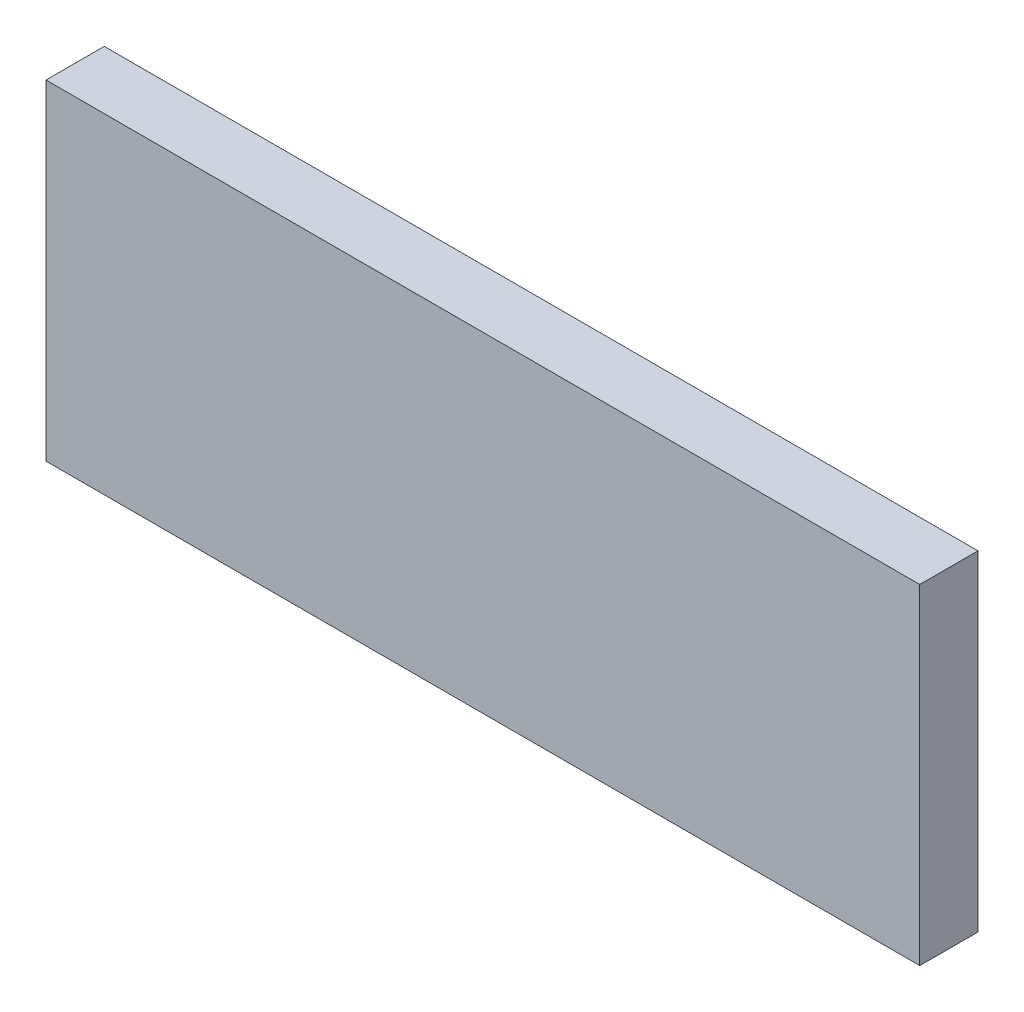
ISO-10303-21;
HEADER;
FILE_DESCRIPTION(('STEP AP214'),'2;1');
FILE_NAME('part.step','',(''),(''),'','','');
FILE_SCHEMA(('AUTOMOTIVE_DESIGN { 1 0 10303 214 1 1 1 1 }'));
ENDSEC;
DATA;
#1=APPLICATION_CONTEXT('core data for automotive mechanical design processes');
#2=APPLICATION_PROTOCOL_DEFINITION('international standard','automotive_design',2000,#1);
#3=PRODUCT_CONTEXT('',#1,'mechanical');
#4=PRODUCT('Part','Part','',(#3));
#5=PRODUCT_RELATED_PRODUCT_CATEGORY('part','',(#4));
#6=PRODUCT_DEFINITION_FORMATION('','',#4);
#7=PRODUCT_DEFINITION_CONTEXT('part definition',#1,'design');
#8=PRODUCT_DEFINITION('design','',#6,#7);
#9=PRODUCT_DEFINITION_SHAPE('','',#8);
#10=(LENGTH_UNIT() NAMED_UNIT(*) SI_UNIT(.MILLI.,.METRE.));
#11=(NAMED_UNIT(*) PLANE_ANGLE_UNIT() SI_UNIT($,.RADIAN.));
#12=(NAMED_UNIT(*) SI_UNIT($,.STERADIAN.) SOLID_ANGLE_UNIT());
#13=UNCERTAINTY_MEASURE_WITH_UNIT(LENGTH_MEASURE(1.E-05),#10,'distance_accuracy_value','');
#14=(GEOMETRIC_REPRESENTATION_CONTEXT(3) GLOBAL_UNCERTAINTY_ASSIGNED_CONTEXT((#13)) GLOBAL_UNIT_ASSIGNED_CONTEXT((#10,
#11,#12)) REPRESENTATION_CONTEXT('',''));
#15=CARTESIAN_POINT('',(0.,0.,0.));
#16=DIRECTION('',(0.,0.,1.));
#17=DIRECTION('',(1.,0.,0.));
#18=AXIS2_PLACEMENT_3D('',#15,#16,#17);
#19=CARTESIAN_POINT('',(0.,0.,300.));
#20=DIRECTION('',(1.,0.,0.));
#21=DIRECTION('',(0.,0.,-1.));
#22=AXIS2_PLACEMENT_3D('',#19,#20,#21);
#23=PLANE('',#22);
#24=DIRECTION('',(0.,-1.,0.));
#25=VECTOR('',#24,1.);
#26=CARTESIAN_POINT('',(0.,0.,0.));
#27=LINE('',#26,#25);
#28=CARTESIAN_POINT('',(0.,1700.,0.));
#29=VERTEX_POINT('',#28);
#30=CARTESIAN_POINT('',(0.,0.,0.));
#31=VERTEX_POINT('',#30);
#32=EDGE_CURVE('E151',#29,#31,#27,.T.);
#33=ORIENTED_EDGE('',*,*,#32,.T.);
#34=DIRECTION('',(0.,0.,-1.));
#35=VECTOR('',#34,1.);
#36=CARTESIAN_POINT('',(0.,0.,300.));
#37=LINE('',#36,#35);
#38=CARTESIAN_POINT('',(0.,0.,300.));
#39=VERTEX_POINT('',#38);
#40=EDGE_CURVE('E140',#39,#31,#37,.T.);
#41=ORIENTED_EDGE('',*,*,#40,.F.);
#42=DIRECTION('',(0.,-1.,0.));
#43=VECTOR('',#42,1.);
#44=CARTESIAN_POINT('',(0.,0.,300.));
#45=LINE('',#44,#43);
#46=CARTESIAN_POINT('',(0.,1700.,300.));
#47=VERTEX_POINT('',#46);
#48=EDGE_CURVE('E132',#47,#39,#45,.T.);
#49=ORIENTED_EDGE('',*,*,#48,.F.);
#50=DIRECTION('',(0.,0.,-1.));
#51=VECTOR('',#50,1.);
#52=CARTESIAN_POINT('',(0.,1700.,300.));
#53=LINE('',#52,#51);
#54=EDGE_CURVE('E147',#47,#29,#53,.T.);
#55=ORIENTED_EDGE('',*,*,#54,.T.);
#56=EDGE_LOOP('',(#33,#41,#49,#55));
#57=FACE_BOUND('',#56,.T.);
#58=ADVANCED_FACE('F40',(#57),#23,.F.);
#59=CARTESIAN_POINT('',(0.,0.,300.));
#60=DIRECTION('',(0.,1.,0.));
#61=DIRECTION('',(0.,0.,1.));
#62=AXIS2_PLACEMENT_3D('',#59,#60,#61);
#63=PLANE('',#62);
#64=DIRECTION('',(1.,0.,0.));
#65=VECTOR('',#64,1.);
#66=CARTESIAN_POINT('',(0.,0.,0.));
#67=LINE('',#66,#65);
#68=CARTESIAN_POINT('',(4500.,0.,0.));
#69=VERTEX_POINT('',#68);
#70=EDGE_CURVE('E138',#31,#69,#67,.T.);
#71=ORIENTED_EDGE('',*,*,#70,.T.);
#72=DIRECTION('',(0.,0.,-1.));
#73=VECTOR('',#72,1.);
#74=CARTESIAN_POINT('',(4500.,0.,300.));
#75=LINE('',#74,#73);
#76=CARTESIAN_POINT('',(4500.,0.,300.));
#77=VERTEX_POINT('',#76);
#78=EDGE_CURVE('E136',#77,#69,#75,.T.);
#79=ORIENTED_EDGE('',*,*,#78,.F.);
#80=DIRECTION('',(1.,0.,0.));
#81=VECTOR('',#80,1.);
#82=CARTESIAN_POINT('',(0.,0.,300.));
#83=LINE('',#82,#81);
#84=EDGE_CURVE('E127',#39,#77,#83,.T.);
#85=ORIENTED_EDGE('',*,*,#84,.F.);
#86=ORIENTED_EDGE('',*,*,#40,.T.);
#87=EDGE_LOOP('',(#71,#79,#85,#86));
#88=FACE_BOUND('',#87,.T.);
#89=ADVANCED_FACE('F137',(#88),#63,.F.);
#90=CARTESIAN_POINT('',(4500.,0.,300.));
#91=DIRECTION('',(-1.,0.,0.));
#92=DIRECTION('',(0.,0.,1.));
#93=AXIS2_PLACEMENT_3D('',#90,#91,#92);
#94=PLANE('',#93);
#95=DIRECTION('',(0.,1.,0.));
#96=VECTOR('',#95,1.);
#97=CARTESIAN_POINT('',(4500.,0.,0.));
#98=LINE('',#97,#96);
#99=CARTESIAN_POINT('',(4500.,1700.,0.));
#100=VERTEX_POINT('',#99);
#101=EDGE_CURVE('E113',#69,#100,#98,.T.);
#102=ORIENTED_EDGE('',*,*,#101,.T.);
#103=DIRECTION('',(0.,0.,-1.));
#104=VECTOR('',#103,1.);
#105=CARTESIAN_POINT('',(4500.,1700.,300.));
#106=LINE('',#105,#104);
#107=CARTESIAN_POINT('',(4500.,1700.,300.));
#108=VERTEX_POINT('',#107);
#109=EDGE_CURVE('E141',#108,#100,#106,.T.);
#110=ORIENTED_EDGE('',*,*,#109,.F.);
#111=DIRECTION('',(0.,1.,0.));
#112=VECTOR('',#111,1.);
#113=CARTESIAN_POINT('',(4500.,0.,300.));
#114=LINE('',#113,#112);
#115=EDGE_CURVE('E130',#77,#108,#114,.T.);
#116=ORIENTED_EDGE('',*,*,#115,.F.);
#117=ORIENTED_EDGE('',*,*,#78,.T.);
#118=EDGE_LOOP('',(#102,#110,#116,#117));
#119=FACE_BOUND('',#118,.T.);
#120=ADVANCED_FACE('F143',(#119),#94,.F.);
#121=CARTESIAN_POINT('',(0.,1700.,300.));
#122=DIRECTION('',(0.,-1.,0.));
#123=DIRECTION('',(0.,0.,-1.));
#124=AXIS2_PLACEMENT_3D('',#121,#122,#123);
#125=PLANE('',#124);
#126=DIRECTION('',(-1.,0.,0.));
#127=VECTOR('',#126,1.);
#128=CARTESIAN_POINT('',(0.,1700.,0.));
#129=LINE('',#128,#127);
#130=EDGE_CURVE('E119',#100,#29,#129,.T.);
#131=ORIENTED_EDGE('',*,*,#130,.T.);
#132=ORIENTED_EDGE('',*,*,#54,.F.);
#133=DIRECTION('',(-1.,0.,0.));
#134=VECTOR('',#133,1.);
#135=CARTESIAN_POINT('',(0.,1700.,300.));
#136=LINE('',#135,#134);
#137=EDGE_CURVE('E96',#108,#47,#136,.T.);
#138=ORIENTED_EDGE('',*,*,#137,.F.);
#139=ORIENTED_EDGE('',*,*,#109,.T.);
#140=EDGE_LOOP('',(#131,#132,#138,#139));
#141=FACE_BOUND('',#140,.T.);
#142=ADVANCED_FACE('F233',(#141),#125,.F.);
#143=CARTESIAN_POINT('',(0.,0.,300.));
#144=DIRECTION('',(0.,0.,-1.));
#145=DIRECTION('',(-1.,0.,0.));
#146=AXIS2_PLACEMENT_3D('',#143,#144,#145);
#147=PLANE('',#146);
#148=ORIENTED_EDGE('',*,*,#48,.T.);
#149=ORIENTED_EDGE('',*,*,#84,.T.);
#150=ORIENTED_EDGE('',*,*,#115,.T.);
#151=ORIENTED_EDGE('',*,*,#137,.T.);
#152=EDGE_LOOP('',(#148,#149,#150,#151));
#153=FACE_BOUND('',#152,.T.);
#154=ADVANCED_FACE('F128',(#153),#147,.F.);
#155=CARTESIAN_POINT('',(0.,0.,0.));
#156=DIRECTION('',(0.,0.,-1.));
#157=DIRECTION('',(-1.,0.,0.));
#158=AXIS2_PLACEMENT_3D('',#155,#156,#157);
#159=PLANE('',#158);
#160=ORIENTED_EDGE('',*,*,#32,.F.);
#161=ORIENTED_EDGE('',*,*,#130,.F.);
#162=ORIENTED_EDGE('',*,*,#101,.F.);
#163=ORIENTED_EDGE('',*,*,#70,.F.);
#164=EDGE_LOOP('',(#160,#161,#162,#163));
#165=FACE_BOUND('',#164,.T.);
#166=ADVANCED_FACE('F236',(#165),#159,.T.);
#167=CLOSED_SHELL('',(#58,#89,#120,#142,#154,#166));
#168=CARTESIAN_POINT('',(50.,0.,300.));
#169=DIRECTION('',(1.,0.,0.));
#170=DIRECTION('',(0.,0.,-1.));
#171=AXIS2_PLACEMENT_3D('',#168,#169,#170);
#172=PLANE('',#171);
#173=DIRECTION('',(0.,-1.,0.));
#174=VECTOR('',#173,1.);
#175=CARTESIAN_POINT('',(50.,0.,50.));
#176=LINE('',#175,#174);
#177=CARTESIAN_POINT('',(50.,1650.,50.));
#178=VERTEX_POINT('',#177);
#179=CARTESIAN_POINT('',(50.,50.,50.));
#180=VERTEX_POINT('',#179);
#181=EDGE_CURVE('E44',#178,#180,#176,.T.);
#182=ORIENTED_EDGE('',*,*,#181,.F.);
#183=DIRECTION('',(0.,0.,-1.));
#184=VECTOR('',#183,1.);
#185=CARTESIAN_POINT('',(50.,1650.,300.));
#186=LINE('',#185,#184);
#187=CARTESIAN_POINT('',(50.,1650.,250.));
#188=VERTEX_POINT('',#187);
#189=EDGE_CURVE('E191',#188,#178,#186,.T.);
#190=ORIENTED_EDGE('',*,*,#189,.F.);
#191=DIRECTION('',(0.,-1.,0.));
#192=VECTOR('',#191,1.);
#193=CARTESIAN_POINT('',(50.,0.,250.));
#194=LINE('',#193,#192);
#195=CARTESIAN_POINT('',(50.,50.,250.));
#196=VERTEX_POINT('',#195);
#197=EDGE_CURVE('E171',#188,#196,#194,.T.);
#198=ORIENTED_EDGE('',*,*,#197,.T.);
#199=DIRECTION('',(0.,0.,-1.));
#200=VECTOR('',#199,1.);
#201=CARTESIAN_POINT('',(50.,50.,300.));
#202=LINE('',#201,#200);
#203=EDGE_CURVE('E187',#196,#180,#202,.T.);
#204=ORIENTED_EDGE('',*,*,#203,.T.);
#205=EDGE_LOOP('',(#182,#190,#198,#204));
#206=FACE_BOUND('',#205,.T.);
#207=ADVANCED_FACE('F200',(#206),#172,.T.);
#208=CARTESIAN_POINT('',(0.,50.,300.));
#209=DIRECTION('',(0.,1.,0.));
#210=DIRECTION('',(0.,0.,1.));
#211=AXIS2_PLACEMENT_3D('',#208,#209,#210);
#212=PLANE('',#211);
#213=DIRECTION('',(1.,0.,0.));
#214=VECTOR('',#213,1.);
#215=CARTESIAN_POINT('',(0.,50.,50.));
#216=LINE('',#215,#214);
#217=CARTESIAN_POINT('',(4450.,50.,50.));
#218=VERTEX_POINT('',#217);
#219=EDGE_CURVE('E61',#180,#218,#216,.T.);
#220=ORIENTED_EDGE('',*,*,#219,.F.);
#221=ORIENTED_EDGE('',*,*,#203,.F.);
#222=DIRECTION('',(1.,0.,0.));
#223=VECTOR('',#222,1.);
#224=CARTESIAN_POINT('',(0.,50.,250.));
#225=LINE('',#224,#223);
#226=CARTESIAN_POINT('',(4450.,50.,250.));
#227=VERTEX_POINT('',#226);
#228=EDGE_CURVE('E84',#196,#227,#225,.T.);
#229=ORIENTED_EDGE('',*,*,#228,.T.);
#230=DIRECTION('',(0.,0.,-1.));
#231=VECTOR('',#230,1.);
#232=CARTESIAN_POINT('',(4450.,50.,300.));
#233=LINE('',#232,#231);
#234=EDGE_CURVE('E181',#227,#218,#233,.T.);
#235=ORIENTED_EDGE('',*,*,#234,.T.);
#236=EDGE_LOOP('',(#220,#221,#229,#235));
#237=FACE_BOUND('',#236,.T.);
#238=ADVANCED_FACE('F201',(#237),#212,.T.);
#239=CARTESIAN_POINT('',(4450.,0.,300.));
#240=DIRECTION('',(-1.,0.,0.));
#241=DIRECTION('',(0.,0.,1.));
#242=AXIS2_PLACEMENT_3D('',#239,#240,#241);
#243=PLANE('',#242);
#244=DIRECTION('',(0.,1.,0.));
#245=VECTOR('',#244,1.);
#246=CARTESIAN_POINT('',(4450.,0.,50.));
#247=LINE('',#246,#245);
#248=CARTESIAN_POINT('',(4450.,1650.,50.));
#249=VERTEX_POINT('',#248);
#250=EDGE_CURVE('E184',#218,#249,#247,.T.);
#251=ORIENTED_EDGE('',*,*,#250,.F.);
#252=ORIENTED_EDGE('',*,*,#234,.F.);
#253=DIRECTION('',(0.,1.,0.));
#254=VECTOR('',#253,1.);
#255=CARTESIAN_POINT('',(4450.,0.,250.));
#256=LINE('',#255,#254);
#257=CARTESIAN_POINT('',(4450.,1650.,250.));
#258=VERTEX_POINT('',#257);
#259=EDGE_CURVE('E52',#227,#258,#256,.T.);
#260=ORIENTED_EDGE('',*,*,#259,.T.);
#261=DIRECTION('',(0.,0.,-1.));
#262=VECTOR('',#261,1.);
#263=CARTESIAN_POINT('',(4450.,1650.,300.));
#264=LINE('',#263,#262);
#265=EDGE_CURVE('E174',#258,#249,#264,.T.);
#266=ORIENTED_EDGE('',*,*,#265,.T.);
#267=EDGE_LOOP('',(#251,#252,#260,#266));
#268=FACE_BOUND('',#267,.T.);
#269=ADVANCED_FACE('F205',(#268),#243,.T.);
#270=CARTESIAN_POINT('',(0.,1650.,300.));
#271=DIRECTION('',(0.,-1.,0.));
#272=DIRECTION('',(0.,0.,-1.));
#273=AXIS2_PLACEMENT_3D('',#270,#271,#272);
#274=PLANE('',#273);
#275=DIRECTION('',(-1.,0.,0.));
#276=VECTOR('',#275,1.);
#277=CARTESIAN_POINT('',(0.,1650.,50.));
#278=LINE('',#277,#276);
#279=EDGE_CURVE('E178',#249,#178,#278,.T.);
#280=ORIENTED_EDGE('',*,*,#279,.F.);
#281=ORIENTED_EDGE('',*,*,#265,.F.);
#282=DIRECTION('',(-1.,0.,0.));
#283=VECTOR('',#282,1.);
#284=CARTESIAN_POINT('',(0.,1650.,250.));
#285=LINE('',#284,#283);
#286=EDGE_CURVE('E11',#258,#188,#285,.T.);
#287=ORIENTED_EDGE('',*,*,#286,.T.);
#288=ORIENTED_EDGE('',*,*,#189,.T.);
#289=EDGE_LOOP('',(#280,#281,#287,#288));
#290=FACE_BOUND('',#289,.T.);
#291=ADVANCED_FACE('F209',(#290),#274,.T.);
#292=CARTESIAN_POINT('',(0.,0.,250.));
#293=DIRECTION('',(0.,0.,-1.));
#294=DIRECTION('',(-1.,0.,0.));
#295=AXIS2_PLACEMENT_3D('',#292,#293,#294);
#296=PLANE('',#295);
#297=ORIENTED_EDGE('',*,*,#197,.F.);
#298=ORIENTED_EDGE('',*,*,#286,.F.);
#299=ORIENTED_EDGE('',*,*,#259,.F.);
#300=ORIENTED_EDGE('',*,*,#228,.F.);
#301=EDGE_LOOP('',(#297,#298,#299,#300));
#302=FACE_BOUND('',#301,.T.);
#303=ADVANCED_FACE('F208',(#302),#296,.T.);
#304=CARTESIAN_POINT('',(0.,0.,50.));
#305=DIRECTION('',(0.,0.,-1.));
#306=DIRECTION('',(-1.,0.,0.));
#307=AXIS2_PLACEMENT_3D('',#304,#305,#306);
#308=PLANE('',#307);
#309=ORIENTED_EDGE('',*,*,#181,.T.);
#310=ORIENTED_EDGE('',*,*,#219,.T.);
#311=ORIENTED_EDGE('',*,*,#250,.T.);
#312=ORIENTED_EDGE('',*,*,#279,.T.);
#313=EDGE_LOOP('',(#309,#310,#311,#312));
#314=FACE_BOUND('',#313,.T.);
#315=ADVANCED_FACE('F42',(#314),#308,.F.);
#316=CLOSED_SHELL('',(#207,#238,#269,#291,#303,#315));
#317=ORIENTED_CLOSED_SHELL('',*,#316,.T.);
#318=BREP_WITH_VOIDS('B2',#167,(#317));
#319=ADVANCED_BREP_SHAPE_REPRESENTATION('',(#18,#318),#14);
#320=SHAPE_DEFINITION_REPRESENTATION(#9,#319);
ENDSEC;
END-ISO-10303-21;
